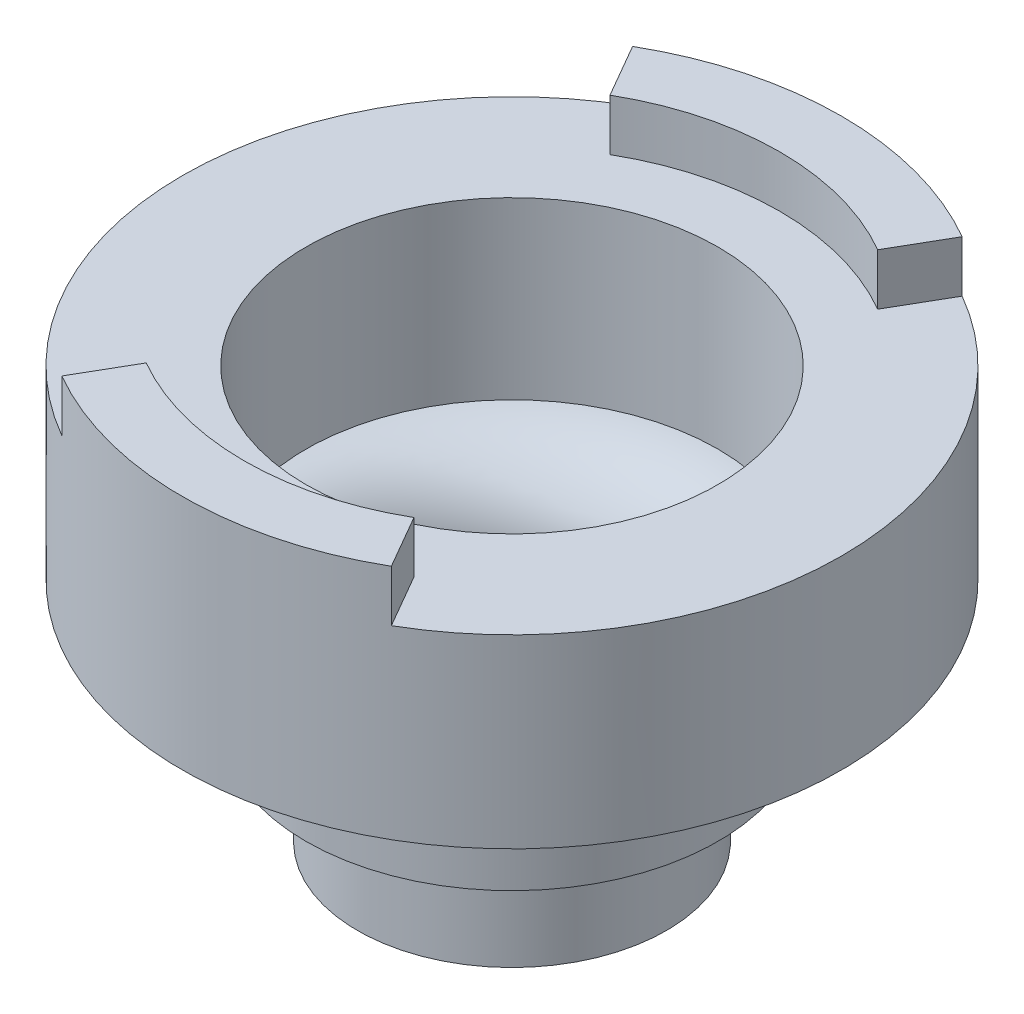
ISO-10303-21;
HEADER;
FILE_DESCRIPTION(('STEP AP214'),'2;1');
FILE_NAME('part.step','',(''),(''),'','','');
FILE_SCHEMA(('AUTOMOTIVE_DESIGN { 1 0 10303 214 1 1 1 1 }'));
ENDSEC;
DATA;
#1=APPLICATION_CONTEXT('core data for automotive mechanical design processes');
#2=APPLICATION_PROTOCOL_DEFINITION('international standard','automotive_design',2000,#1);
#3=PRODUCT_CONTEXT('',#1,'mechanical');
#4=PRODUCT('Part','Part','',(#3));
#5=PRODUCT_RELATED_PRODUCT_CATEGORY('part','',(#4));
#6=PRODUCT_DEFINITION_FORMATION('','',#4);
#7=PRODUCT_DEFINITION_CONTEXT('part definition',#1,'design');
#8=PRODUCT_DEFINITION('design','',#6,#7);
#9=PRODUCT_DEFINITION_SHAPE('','',#8);
#10=(LENGTH_UNIT() NAMED_UNIT(*) SI_UNIT(.MILLI.,.METRE.));
#11=(NAMED_UNIT(*) PLANE_ANGLE_UNIT() SI_UNIT($,.RADIAN.));
#12=(NAMED_UNIT(*) SI_UNIT($,.STERADIAN.) SOLID_ANGLE_UNIT());
#13=UNCERTAINTY_MEASURE_WITH_UNIT(LENGTH_MEASURE(1.E-05),#10,'distance_accuracy_value','');
#14=(GEOMETRIC_REPRESENTATION_CONTEXT(3) GLOBAL_UNCERTAINTY_ASSIGNED_CONTEXT((#13)) GLOBAL_UNIT_ASSIGNED_CONTEXT((#10,
#11,#12)) REPRESENTATION_CONTEXT('',''));
#15=CARTESIAN_POINT('',(0.,0.,0.));
#16=DIRECTION('',(0.,0.,1.));
#17=DIRECTION('',(1.,0.,0.));
#18=AXIS2_PLACEMENT_3D('',#15,#16,#17);
#19=CARTESIAN_POINT('',(0.,0.,0.));
#20=DIRECTION('',(0.,-1.,0.));
#21=DIRECTION('',(0.,0.,-1.));
#22=AXIS2_PLACEMENT_3D('',#19,#20,#21);
#23=PLANE('',#22);
#24=CARTESIAN_POINT('',(0.,0.,0.));
#25=DIRECTION('',(0.,1.,0.));
#26=DIRECTION('',(0.,0.,1.));
#27=AXIS2_PLACEMENT_3D('',#24,#25,#26);
#28=CIRCLE('',#27,20.);
#29=CARTESIAN_POINT('',(0.,0.,20.));
#30=VERTEX_POINT('',#29);
#31=EDGE_CURVE('E207',#30,#30,#28,.T.);
#32=ORIENTED_EDGE('',*,*,#31,.F.);
#33=EDGE_LOOP('',(#32));
#34=FACE_BOUND('',#33,.T.);
#35=DIRECTION('',(-0.500000000000002,0.,-0.866025403784437));
#36=VECTOR('',#35,1.);
#37=CARTESIAN_POINT('',(13.,0.,22.5166604983954));
#38=LINE('',#37,#36);
#39=CARTESIAN_POINT('',(16.,0.,27.712812921102));
#40=VERTEX_POINT('',#39);
#41=CARTESIAN_POINT('',(13.,0.,22.5166604983954));
#42=VERTEX_POINT('',#41);
#43=EDGE_CURVE('E122',#40,#42,#38,.T.);
#44=ORIENTED_EDGE('',*,*,#43,.F.);
#45=CARTESIAN_POINT('',(0.,0.,0.));
#46=DIRECTION('',(0.,-1.,0.));
#47=DIRECTION('',(0.,0.,-1.));
#48=AXIS2_PLACEMENT_3D('',#45,#46,#47);
#49=CIRCLE('',#48,32.);
#50=CARTESIAN_POINT('',(16.0000000000001,0.,-27.712812921102));
#51=VERTEX_POINT('',#50);
#52=EDGE_CURVE('E11',#51,#40,#49,.T.);
#53=ORIENTED_EDGE('',*,*,#52,.F.);
#54=DIRECTION('',(0.500000000000002,0.,-0.866025403784437));
#55=VECTOR('',#54,1.);
#56=CARTESIAN_POINT('',(13.,0.,-22.5166604983954));
#57=LINE('',#56,#55);
#58=CARTESIAN_POINT('',(13.,0.,-22.5166604983954));
#59=VERTEX_POINT('',#58);
#60=EDGE_CURVE('E151',#59,#51,#57,.T.);
#61=ORIENTED_EDGE('',*,*,#60,.F.);
#62=CARTESIAN_POINT('',(0.,0.,0.));
#63=DIRECTION('',(0.,-1.,0.));
#64=DIRECTION('',(0.,0.,1.));
#65=AXIS2_PLACEMENT_3D('',#62,#63,#64);
#66=CIRCLE('',#65,26.);
#67=CARTESIAN_POINT('',(-13.,0.,-22.5166604983954));
#68=VERTEX_POINT('',#67);
#69=EDGE_CURVE('E155',#68,#59,#66,.T.);
#70=ORIENTED_EDGE('',*,*,#69,.F.);
#71=DIRECTION('',(0.500000000000002,0.,0.866025403784438));
#72=VECTOR('',#71,1.);
#73=CARTESIAN_POINT('',(-16.,0.,-27.712812921102));
#74=LINE('',#73,#72);
#75=CARTESIAN_POINT('',(-16.,0.,-27.712812921102));
#76=VERTEX_POINT('',#75);
#77=EDGE_CURVE('E148',#76,#68,#74,.T.);
#78=ORIENTED_EDGE('',*,*,#77,.F.);
#79=CARTESIAN_POINT('',(-16.,0.,27.7128129211021));
#80=VERTEX_POINT('',#79);
#81=EDGE_CURVE('E48',#80,#76,#49,.T.);
#82=ORIENTED_EDGE('',*,*,#81,.F.);
#83=DIRECTION('',(-0.500000000000002,0.,0.866025403784438));
#84=VECTOR('',#83,1.);
#85=CARTESIAN_POINT('',(-16.0000000000001,0.,27.712812921102));
#86=LINE('',#85,#84);
#87=CARTESIAN_POINT('',(-13.,0.,22.5166604983954));
#88=VERTEX_POINT('',#87);
#89=EDGE_CURVE('E60',#88,#80,#86,.T.);
#90=ORIENTED_EDGE('',*,*,#89,.F.);
#91=CARTESIAN_POINT('',(0.,0.,0.));
#92=DIRECTION('',(0.,-1.,0.));
#93=DIRECTION('',(0.,0.,-1.));
#94=AXIS2_PLACEMENT_3D('',#91,#92,#93);
#95=CIRCLE('',#94,26.);
#96=EDGE_CURVE('E55',#42,#88,#95,.T.);
#97=ORIENTED_EDGE('',*,*,#96,.F.);
#98=EDGE_LOOP('',(#44,#53,#61,#70,#78,#82,#90,#97));
#99=FACE_BOUND('',#98,.T.);
#100=ADVANCED_FACE('F39',(#34,#99),#23,.F.);
#101=CARTESIAN_POINT('',(0.,-40.,0.));
#102=DIRECTION('',(0.,1.,0.));
#103=DIRECTION('',(0.,0.,1.));
#104=AXIS2_PLACEMENT_3D('',#101,#102,#103);
#105=PLANE('',#104);
#106=CARTESIAN_POINT('',(0.,-40.,0.));
#107=DIRECTION('',(0.,-1.,0.));
#108=DIRECTION('',(0.,0.,-1.));
#109=AXIS2_PLACEMENT_3D('',#106,#107,#108);
#110=CIRCLE('',#109,8.);
#111=CARTESIAN_POINT('',(0.,-40.,-8.));
#112=VERTEX_POINT('',#111);
#113=EDGE_CURVE('E138',#112,#112,#110,.T.);
#114=ORIENTED_EDGE('',*,*,#113,.F.);
#115=EDGE_LOOP('',(#114));
#116=FACE_BOUND('',#115,.T.);
#117=CARTESIAN_POINT('',(0.,-40.,0.));
#118=DIRECTION('',(0.,-1.,0.));
#119=DIRECTION('',(0.,0.,-1.));
#120=AXIS2_PLACEMENT_3D('',#117,#118,#119);
#121=CIRCLE('',#120,15.);
#122=CARTESIAN_POINT('',(0.,-40.,-15.));
#123=VERTEX_POINT('',#122);
#124=EDGE_CURVE('E125',#123,#123,#121,.T.);
#125=ORIENTED_EDGE('',*,*,#124,.T.);
#126=EDGE_LOOP('',(#125));
#127=FACE_BOUND('',#126,.T.);
#128=ADVANCED_FACE('F41',(#116,#127),#105,.F.);
#129=CARTESIAN_POINT('',(0.,-68.1198392035178,0.));
#130=DIRECTION('',(0.,-1.,0.));
#131=DIRECTION('',(0.,0.,-1.));
#132=AXIS2_PLACEMENT_3D('',#129,#130,#131);
#133=CYLINDRICAL_SURFACE('',#132,32.);
#134=CARTESIAN_POINT('',(0.,-18.,0.));
#135=DIRECTION('',(0.,-1.,0.));
#136=DIRECTION('',(0.,0.,-1.));
#137=AXIS2_PLACEMENT_3D('',#134,#135,#136);
#138=CIRCLE('',#137,32.);
#139=CARTESIAN_POINT('',(0.,-18.,-32.));
#140=VERTEX_POINT('',#139);
#141=EDGE_CURVE('E173',#140,#140,#138,.T.);
#142=ORIENTED_EDGE('',*,*,#141,.F.);
#143=EDGE_LOOP('',(#142));
#144=FACE_BOUND('',#143,.T.);
#145=ORIENTED_EDGE('',*,*,#52,.T.);
#146=DIRECTION('',(0.,-1.,0.));
#147=VECTOR('',#146,1.);
#148=CARTESIAN_POINT('',(16.,5.,27.712812921102));
#149=LINE('',#148,#147);
#150=CARTESIAN_POINT('',(16.,5.,27.712812921102));
#151=VERTEX_POINT('',#150);
#152=EDGE_CURVE('E130',#151,#40,#149,.T.);
#153=ORIENTED_EDGE('',*,*,#152,.F.);
#154=CARTESIAN_POINT('',(0.,5.,0.));
#155=DIRECTION('',(0.,1.,0.));
#156=DIRECTION('',(0.,0.,-1.));
#157=AXIS2_PLACEMENT_3D('',#154,#155,#156);
#158=CIRCLE('',#157,32.0000000000001);
#159=CARTESIAN_POINT('',(-16.,5.,27.7128129211021));
#160=VERTEX_POINT('',#159);
#161=EDGE_CURVE('E112',#160,#151,#158,.T.);
#162=ORIENTED_EDGE('',*,*,#161,.F.);
#163=DIRECTION('',(0.,-1.,0.));
#164=VECTOR('',#163,1.);
#165=CARTESIAN_POINT('',(-16.,5.,27.7128129211021));
#166=LINE('',#165,#164);
#167=EDGE_CURVE('E109',#160,#80,#166,.T.);
#168=ORIENTED_EDGE('',*,*,#167,.T.);
#169=ORIENTED_EDGE('',*,*,#81,.T.);
#170=DIRECTION('',(0.,-1.,0.));
#171=VECTOR('',#170,1.);
#172=CARTESIAN_POINT('',(-16.,5.,-27.712812921102));
#173=LINE('',#172,#171);
#174=CARTESIAN_POINT('',(-16.,5.,-27.712812921102));
#175=VERTEX_POINT('',#174);
#176=EDGE_CURVE('E141',#175,#76,#173,.T.);
#177=ORIENTED_EDGE('',*,*,#176,.F.);
#178=CARTESIAN_POINT('',(0.,5.,0.));
#179=DIRECTION('',(0.,1.,0.));
#180=DIRECTION('',(0.,0.,1.));
#181=AXIS2_PLACEMENT_3D('',#178,#179,#180);
#182=CIRCLE('',#181,32.);
#183=CARTESIAN_POINT('',(16.0000000000001,5.,-27.712812921102));
#184=VERTEX_POINT('',#183);
#185=EDGE_CURVE('E159',#184,#175,#182,.T.);
#186=ORIENTED_EDGE('',*,*,#185,.F.);
#187=DIRECTION('',(0.,-1.,0.));
#188=VECTOR('',#187,1.);
#189=CARTESIAN_POINT('',(16.0000000000001,5.,-27.712812921102));
#190=LINE('',#189,#188);
#191=EDGE_CURVE('E137',#184,#51,#190,.T.);
#192=ORIENTED_EDGE('',*,*,#191,.T.);
#193=EDGE_LOOP('',(#145,#153,#162,#168,#169,#177,#186,#192));
#194=FACE_BOUND('',#193,.T.);
#195=ADVANCED_FACE('F180',(#144,#194),#133,.T.);
#196=CARTESIAN_POINT('',(0.,-18.,0.));
#197=DIRECTION('',(0.,1.,0.));
#198=DIRECTION('',(0.,0.,1.));
#199=AXIS2_PLACEMENT_3D('',#196,#197,#198);
#200=CONICAL_SURFACE('',#199,32.,1.04272187836854);
#201=CARTESIAN_POINT('',(0.,-25.,0.));
#202=DIRECTION('',(0.,-1.,0.));
#203=DIRECTION('',(0.,0.,-1.));
#204=AXIS2_PLACEMENT_3D('',#201,#202,#203);
#205=CIRCLE('',#204,20.);
#206=CARTESIAN_POINT('',(0.,-25.,-20.));
#207=VERTEX_POINT('',#206);
#208=EDGE_CURVE('E170',#207,#207,#205,.T.);
#209=ORIENTED_EDGE('',*,*,#208,.F.);
#210=EDGE_LOOP('',(#209));
#211=FACE_BOUND('',#210,.T.);
#212=ORIENTED_EDGE('',*,*,#141,.T.);
#213=EDGE_LOOP('',(#212));
#214=FACE_BOUND('',#213,.T.);
#215=ADVANCED_FACE('F242',(#211,#214),#200,.T.);
#216=CARTESIAN_POINT('',(0.,-68.1198392035178,0.));
#217=DIRECTION('',(0.,-1.,0.));
#218=DIRECTION('',(0.,0.,-1.));
#219=AXIS2_PLACEMENT_3D('',#216,#217,#218);
#220=CYLINDRICAL_SURFACE('',#219,20.);
#221=CARTESIAN_POINT('',(0.,-30.,0.));
#222=DIRECTION('',(0.,-1.,0.));
#223=DIRECTION('',(0.,0.,-1.));
#224=AXIS2_PLACEMENT_3D('',#221,#222,#223);
#225=CIRCLE('',#224,20.);
#226=CARTESIAN_POINT('',(0.,-30.,-20.));
#227=VERTEX_POINT('',#226);
#228=EDGE_CURVE('E167',#227,#227,#225,.T.);
#229=ORIENTED_EDGE('',*,*,#228,.F.);
#230=EDGE_LOOP('',(#229));
#231=FACE_BOUND('',#230,.T.);
#232=ORIENTED_EDGE('',*,*,#208,.T.);
#233=EDGE_LOOP('',(#232));
#234=FACE_BOUND('',#233,.T.);
#235=ADVANCED_FACE('F246',(#231,#234),#220,.T.);
#236=CARTESIAN_POINT('',(0.,-30.,0.));
#237=DIRECTION('',(0.,1.,0.));
#238=DIRECTION('',(0.,0.,1.));
#239=AXIS2_PLACEMENT_3D('',#236,#237,#238);
#240=PLANE('',#239);
#241=CARTESIAN_POINT('',(0.,-30.,0.));
#242=DIRECTION('',(0.,-1.,0.));
#243=DIRECTION('',(0.,0.,-1.));
#244=AXIS2_PLACEMENT_3D('',#241,#242,#243);
#245=CIRCLE('',#244,15.);
#246=CARTESIAN_POINT('',(0.,-30.,-15.));
#247=VERTEX_POINT('',#246);
#248=EDGE_CURVE('E128',#247,#247,#245,.T.);
#249=ORIENTED_EDGE('',*,*,#248,.F.);
#250=EDGE_LOOP('',(#249));
#251=FACE_BOUND('',#250,.T.);
#252=ORIENTED_EDGE('',*,*,#228,.T.);
#253=EDGE_LOOP('',(#252));
#254=FACE_BOUND('',#253,.T.);
#255=ADVANCED_FACE('F250',(#251,#254),#240,.F.);
#256=CARTESIAN_POINT('',(0.,-68.1198392035178,0.));
#257=DIRECTION('',(0.,-1.,0.));
#258=DIRECTION('',(0.,0.,-1.));
#259=AXIS2_PLACEMENT_3D('',#256,#257,#258);
#260=CYLINDRICAL_SURFACE('',#259,15.);
#261=ORIENTED_EDGE('',*,*,#124,.F.);
#262=EDGE_LOOP('',(#261));
#263=FACE_BOUND('',#262,.T.);
#264=ORIENTED_EDGE('',*,*,#248,.T.);
#265=EDGE_LOOP('',(#264));
#266=FACE_BOUND('',#265,.T.);
#267=ADVANCED_FACE('F254',(#263,#266),#260,.T.);
#268=CARTESIAN_POINT('',(0.,5.,0.));
#269=DIRECTION('',(0.,-1.,0.));
#270=DIRECTION('',(0.,0.,-1.));
#271=AXIS2_PLACEMENT_3D('',#268,#269,#270);
#272=CYLINDRICAL_SURFACE('',#271,26.);
#273=ORIENTED_EDGE('',*,*,#69,.T.);
#274=DIRECTION('',(0.,-1.,0.));
#275=VECTOR('',#274,1.);
#276=CARTESIAN_POINT('',(13.,5.,-22.5166604983954));
#277=LINE('',#276,#275);
#278=CARTESIAN_POINT('',(13.,5.,-22.5166604983954));
#279=VERTEX_POINT('',#278);
#280=EDGE_CURVE('E134',#279,#59,#277,.T.);
#281=ORIENTED_EDGE('',*,*,#280,.F.);
#282=CARTESIAN_POINT('',(0.,5.,0.));
#283=DIRECTION('',(0.,-1.,0.));
#284=DIRECTION('',(0.,0.,1.));
#285=AXIS2_PLACEMENT_3D('',#282,#283,#284);
#286=CIRCLE('',#285,26.);
#287=CARTESIAN_POINT('',(-13.,5.,-22.5166604983954));
#288=VERTEX_POINT('',#287);
#289=EDGE_CURVE('E152',#288,#279,#286,.T.);
#290=ORIENTED_EDGE('',*,*,#289,.F.);
#291=DIRECTION('',(0.,-1.,0.));
#292=VECTOR('',#291,1.);
#293=CARTESIAN_POINT('',(-13.,5.,-22.5166604983954));
#294=LINE('',#293,#292);
#295=EDGE_CURVE('E144',#288,#68,#294,.T.);
#296=ORIENTED_EDGE('',*,*,#295,.T.);
#297=EDGE_LOOP('',(#273,#281,#290,#296));
#298=FACE_BOUND('',#297,.T.);
#299=ADVANCED_FACE('F258',(#298),#272,.F.);
#300=CARTESIAN_POINT('',(13.,5.,-22.5166604983954));
#301=DIRECTION('',(-0.866025403784437,0.,-0.500000000000002));
#302=DIRECTION('',(-0.500000000000002,0.,0.866025403784437));
#303=AXIS2_PLACEMENT_3D('',#300,#301,#302);
#304=PLANE('',#303);
#305=ORIENTED_EDGE('',*,*,#60,.T.);
#306=ORIENTED_EDGE('',*,*,#191,.F.);
#307=DIRECTION('',(0.500000000000002,0.,-0.866025403784437));
#308=VECTOR('',#307,1.);
#309=CARTESIAN_POINT('',(13.,5.,-22.5166604983954));
#310=LINE('',#309,#308);
#311=EDGE_CURVE('E161',#279,#184,#310,.T.);
#312=ORIENTED_EDGE('',*,*,#311,.F.);
#313=ORIENTED_EDGE('',*,*,#280,.T.);
#314=EDGE_LOOP('',(#305,#306,#312,#313));
#315=FACE_BOUND('',#314,.T.);
#316=ADVANCED_FACE('F194',(#315),#304,.F.);
#317=CARTESIAN_POINT('',(-16.,5.,-27.712812921102));
#318=DIRECTION('',(0.866025403784438,0.,-0.500000000000002));
#319=DIRECTION('',(-0.500000000000002,0.,-0.866025403784438));
#320=AXIS2_PLACEMENT_3D('',#317,#318,#319);
#321=PLANE('',#320);
#322=ORIENTED_EDGE('',*,*,#77,.T.);
#323=ORIENTED_EDGE('',*,*,#295,.F.);
#324=DIRECTION('',(0.500000000000002,0.,0.866025403784438));
#325=VECTOR('',#324,1.);
#326=CARTESIAN_POINT('',(-16.,5.,-27.712812921102));
#327=LINE('',#326,#325);
#328=EDGE_CURVE('E147',#175,#288,#327,.T.);
#329=ORIENTED_EDGE('',*,*,#328,.F.);
#330=ORIENTED_EDGE('',*,*,#176,.T.);
#331=EDGE_LOOP('',(#322,#323,#329,#330));
#332=FACE_BOUND('',#331,.T.);
#333=ADVANCED_FACE('F184',(#332),#321,.F.);
#334=CARTESIAN_POINT('',(0.,5.,0.));
#335=DIRECTION('',(0.,1.,0.));
#336=DIRECTION('',(0.,0.,1.));
#337=AXIS2_PLACEMENT_3D('',#334,#335,#336);
#338=PLANE('',#337);
#339=ORIENTED_EDGE('',*,*,#289,.T.);
#340=ORIENTED_EDGE('',*,*,#311,.T.);
#341=ORIENTED_EDGE('',*,*,#185,.T.);
#342=ORIENTED_EDGE('',*,*,#328,.T.);
#343=EDGE_LOOP('',(#339,#340,#341,#342));
#344=FACE_BOUND('',#343,.T.);
#345=ADVANCED_FACE('F188',(#344),#338,.T.);
#346=CARTESIAN_POINT('',(0.,5.,0.));
#347=DIRECTION('',(0.,-1.,0.));
#348=DIRECTION('',(0.,0.,-1.));
#349=AXIS2_PLACEMENT_3D('',#346,#347,#348);
#350=CYLINDRICAL_SURFACE('',#349,26.);
#351=ORIENTED_EDGE('',*,*,#96,.T.);
#352=DIRECTION('',(0.,-1.,0.));
#353=VECTOR('',#352,1.);
#354=CARTESIAN_POINT('',(-13.,5.,22.5166604983954));
#355=LINE('',#354,#353);
#356=CARTESIAN_POINT('',(-13.,5.,22.5166604983954));
#357=VERTEX_POINT('',#356);
#358=EDGE_CURVE('E107',#357,#88,#355,.T.);
#359=ORIENTED_EDGE('',*,*,#358,.F.);
#360=CARTESIAN_POINT('',(0.,5.,0.));
#361=DIRECTION('',(0.,-1.,0.));
#362=DIRECTION('',(0.,0.,-1.));
#363=AXIS2_PLACEMENT_3D('',#360,#361,#362);
#364=CIRCLE('',#363,26.);
#365=CARTESIAN_POINT('',(13.,5.,22.5166604983954));
#366=VERTEX_POINT('',#365);
#367=EDGE_CURVE('E113',#366,#357,#364,.T.);
#368=ORIENTED_EDGE('',*,*,#367,.F.);
#369=DIRECTION('',(0.,-1.,0.));
#370=VECTOR('',#369,1.);
#371=CARTESIAN_POINT('',(13.,5.,22.5166604983954));
#372=LINE('',#371,#370);
#373=EDGE_CURVE('E200',#366,#42,#372,.T.);
#374=ORIENTED_EDGE('',*,*,#373,.T.);
#375=EDGE_LOOP('',(#351,#359,#368,#374));
#376=FACE_BOUND('',#375,.T.);
#377=ADVANCED_FACE('F124',(#376),#350,.F.);
#378=CARTESIAN_POINT('',(-16.0000000000001,5.,27.712812921102));
#379=DIRECTION('',(0.866025403784438,0.,0.500000000000002));
#380=DIRECTION('',(0.500000000000002,0.,-0.866025403784437));
#381=AXIS2_PLACEMENT_3D('',#378,#379,#380);
#382=PLANE('',#381);
#383=ORIENTED_EDGE('',*,*,#89,.T.);
#384=ORIENTED_EDGE('',*,*,#167,.F.);
#385=DIRECTION('',(-0.500000000000002,0.,0.866025403784438));
#386=VECTOR('',#385,1.);
#387=CARTESIAN_POINT('',(-16.0000000000001,5.,27.712812921102));
#388=LINE('',#387,#386);
#389=EDGE_CURVE('E103',#357,#160,#388,.T.);
#390=ORIENTED_EDGE('',*,*,#389,.F.);
#391=ORIENTED_EDGE('',*,*,#358,.T.);
#392=EDGE_LOOP('',(#383,#384,#390,#391));
#393=FACE_BOUND('',#392,.T.);
#394=ADVANCED_FACE('F105',(#393),#382,.F.);
#395=CARTESIAN_POINT('',(13.,5.,22.5166604983954));
#396=DIRECTION('',(-0.866025403784438,0.,0.500000000000002));
#397=DIRECTION('',(0.500000000000002,0.,0.866025403784438));
#398=AXIS2_PLACEMENT_3D('',#395,#396,#397);
#399=PLANE('',#398);
#400=ORIENTED_EDGE('',*,*,#43,.T.);
#401=ORIENTED_EDGE('',*,*,#373,.F.);
#402=DIRECTION('',(-0.500000000000002,0.,-0.866025403784437));
#403=VECTOR('',#402,1.);
#404=CARTESIAN_POINT('',(13.,5.,22.5166604983954));
#405=LINE('',#404,#403);
#406=EDGE_CURVE('E118',#151,#366,#405,.T.);
#407=ORIENTED_EDGE('',*,*,#406,.F.);
#408=ORIENTED_EDGE('',*,*,#152,.T.);
#409=EDGE_LOOP('',(#400,#401,#407,#408));
#410=FACE_BOUND('',#409,.T.);
#411=ADVANCED_FACE('F201',(#410),#399,.F.);
#412=CARTESIAN_POINT('',(0.,5.,0.));
#413=DIRECTION('',(0.,-1.,0.));
#414=DIRECTION('',(0.,0.,-1.));
#415=AXIS2_PLACEMENT_3D('',#412,#413,#414);
#416=PLANE('',#415);
#417=ORIENTED_EDGE('',*,*,#367,.T.);
#418=ORIENTED_EDGE('',*,*,#389,.T.);
#419=ORIENTED_EDGE('',*,*,#161,.T.);
#420=ORIENTED_EDGE('',*,*,#406,.T.);
#421=EDGE_LOOP('',(#417,#418,#419,#420));
#422=FACE_BOUND('',#421,.T.);
#423=ADVANCED_FACE('F116',(#422),#416,.F.);
#424=CARTESIAN_POINT('',(0.,5.,0.));
#425=DIRECTION('',(0.,-1.,0.));
#426=DIRECTION('',(0.,0.,-1.));
#427=AXIS2_PLACEMENT_3D('',#424,#425,#426);
#428=CYLINDRICAL_SURFACE('',#427,8.);
#429=CARTESIAN_POINT('',(0.,-25.,0.));
#430=DIRECTION('',(0.,-1.,0.));
#431=DIRECTION('',(0.,0.,-1.));
#432=AXIS2_PLACEMENT_3D('',#429,#430,#431);
#433=CIRCLE('',#432,8.);
#434=CARTESIAN_POINT('',(0.,-25.,-8.));
#435=VERTEX_POINT('',#434);
#436=EDGE_CURVE('E43',#435,#435,#433,.F.);
#437=CARTESIAN_POINT('',(0.,-25.,-8.));
#438=CARTESIAN_POINT('',(0.,-25.15625,-8.));
#439=CARTESIAN_POINT('',(0.,-25.3125,-8.));
#440=CARTESIAN_POINT('',(0.,-25.625,-8.));
#441=CARTESIAN_POINT('',(0.,-25.78125,-8.));
#442=CARTESIAN_POINT('',(0.,-26.09375,-8.));
#443=CARTESIAN_POINT('',(0.,-26.25,-8.));
#444=CARTESIAN_POINT('',(0.,-26.5625,-8.));
#445=CARTESIAN_POINT('',(0.,-26.71875,-8.));
#446=CARTESIAN_POINT('',(0.,-27.03125,-8.));
#447=CARTESIAN_POINT('',(0.,-27.1875,-8.));
#448=CARTESIAN_POINT('',(0.,-27.5,-8.));
#449=CARTESIAN_POINT('',(0.,-27.65625,-8.));
#450=CARTESIAN_POINT('',(0.,-27.96875,-8.));
#451=CARTESIAN_POINT('',(0.,-28.125,-8.));
#452=CARTESIAN_POINT('',(0.,-28.4375,-8.));
#453=CARTESIAN_POINT('',(0.,-28.59375,-8.));
#454=CARTESIAN_POINT('',(0.,-28.90625,-8.));
#455=CARTESIAN_POINT('',(0.,-29.0625,-8.));
#456=CARTESIAN_POINT('',(0.,-29.375,-8.));
#457=CARTESIAN_POINT('',(0.,-29.53125,-8.));
#458=CARTESIAN_POINT('',(0.,-29.84375,-8.));
#459=CARTESIAN_POINT('',(0.,-30.,-8.));
#460=CARTESIAN_POINT('',(0.,-30.3125,-8.));
#461=CARTESIAN_POINT('',(0.,-30.46875,-8.));
#462=CARTESIAN_POINT('',(0.,-30.78125,-8.));
#463=CARTESIAN_POINT('',(0.,-30.9375,-8.));
#464=CARTESIAN_POINT('',(0.,-31.25,-8.));
#465=CARTESIAN_POINT('',(0.,-31.40625,-8.));
#466=CARTESIAN_POINT('',(0.,-31.71875,-8.));
#467=CARTESIAN_POINT('',(0.,-31.875,-8.));
#468=CARTESIAN_POINT('',(0.,-32.1875,-8.));
#469=CARTESIAN_POINT('',(0.,-32.34375,-8.));
#470=CARTESIAN_POINT('',(0.,-32.65625,-8.));
#471=CARTESIAN_POINT('',(0.,-32.8125,-8.));
#472=CARTESIAN_POINT('',(0.,-33.125,-8.));
#473=CARTESIAN_POINT('',(0.,-33.28125,-8.));
#474=CARTESIAN_POINT('',(0.,-33.59375,-8.));
#475=CARTESIAN_POINT('',(0.,-33.75,-8.));
#476=CARTESIAN_POINT('',(0.,-34.0625,-8.));
#477=CARTESIAN_POINT('',(0.,-34.21875,-8.));
#478=CARTESIAN_POINT('',(0.,-34.53125,-8.));
#479=CARTESIAN_POINT('',(0.,-34.6875,-8.));
#480=CARTESIAN_POINT('',(0.,-35.,-8.));
#481=CARTESIAN_POINT('',(0.,-35.15625,-8.));
#482=CARTESIAN_POINT('',(0.,-35.46875,-8.));
#483=CARTESIAN_POINT('',(0.,-35.625,-8.));
#484=CARTESIAN_POINT('',(0.,-35.9375,-8.));
#485=CARTESIAN_POINT('',(0.,-36.09375,-8.));
#486=CARTESIAN_POINT('',(0.,-36.40625,-8.));
#487=CARTESIAN_POINT('',(0.,-36.5625,-8.));
#488=CARTESIAN_POINT('',(0.,-36.875,-8.));
#489=CARTESIAN_POINT('',(0.,-37.03125,-8.));
#490=CARTESIAN_POINT('',(0.,-37.34375,-8.));
#491=CARTESIAN_POINT('',(0.,-37.5,-8.));
#492=CARTESIAN_POINT('',(0.,-37.8125,-8.));
#493=CARTESIAN_POINT('',(0.,-37.96875,-8.));
#494=CARTESIAN_POINT('',(0.,-38.28125,-8.));
#495=CARTESIAN_POINT('',(0.,-38.4375,-8.));
#496=CARTESIAN_POINT('',(0.,-38.75,-8.));
#497=CARTESIAN_POINT('',(0.,-38.90625,-8.));
#498=CARTESIAN_POINT('',(0.,-39.21875,-8.));
#499=CARTESIAN_POINT('',(0.,-39.375,-8.));
#500=CARTESIAN_POINT('',(0.,-39.6875,-8.));
#501=CARTESIAN_POINT('',(0.,-39.84375,-8.));
#502=CARTESIAN_POINT('',(0.,-40.,-8.));
#503=B_SPLINE_CURVE_WITH_KNOTS('',3,(#437,#438,#439,#440,#441,#442,#443,#444,#445,#446,#447,
#448,#449,#450,#451,#452,#453,#454,#455,#456,#457,#458,#459,#460,#461,#462,#463,#464,#465,#466,
#467,#468,#469,#470,#471,#472,#473,#474,#475,#476,#477,#478,#479,#480,#481,#482,#483,#484,#485,
#486,#487,#488,#489,#490,#491,#492,#493,#494,#495,#496,#497,#498,#499,#500,#501,#502),
.UNSPECIFIED.,.F.,.F.,(4,2,2,2,2,2,2,2,2,2,2,2,2,2,2,2,2,2,2,2,2,2,2,2,2,2,2,2,2,2,2,2,4),(0.,
0.46875,0.937500000000001,1.40624999999999,1.875,2.34375,2.8125,3.28125,3.75,4.21875,4.6875,
5.15625,5.625,6.09375,6.5625,7.03125,7.5,7.96875,8.4375,8.90625,9.375,9.84375,10.3125,10.78125,
11.25,11.71875,12.1875,12.65625,13.125,13.59375,14.0625,14.53125,15.),.UNSPECIFIED.);
#504=EDGE_CURVE('BSEAM277',#435,#112,#503,.T.);
#505=ORIENTED_EDGE('',*,*,#436,.T.);
#506=ORIENTED_EDGE('',*,*,#113,.T.);
#507=ORIENTED_EDGE('',*,*,#504,.T.);
#508=ORIENTED_EDGE('',*,*,#504,.F.);
#509=EDGE_LOOP('',(#505,#507,#506,#508));
#510=FACE_BOUND('',#509,.T.);
#511=ADVANCED_FACE('F277',(#510),#428,.F.);
#512=CARTESIAN_POINT('',(0.,-25.,0.));
#513=DIRECTION('',(0.,-1.,0.));
#514=DIRECTION('',(0.,0.,-1.));
#515=AXIS2_PLACEMENT_3D('',#512,#513,#514);
#516=PLANE('',#515);
#517=CARTESIAN_POINT('',(0.,-25.,0.));
#518=DIRECTION('',(0.,1.,0.));
#519=DIRECTION('',(0.,0.,1.));
#520=AXIS2_PLACEMENT_3D('',#517,#518,#519);
#521=CIRCLE('',#520,12.);
#522=CARTESIAN_POINT('',(0.,-25.,12.));
#523=VERTEX_POINT('',#522);
#524=EDGE_CURVE('E213',#523,#523,#521,.T.);
#525=ORIENTED_EDGE('',*,*,#524,.T.);
#526=EDGE_LOOP('',(#525));
#527=FACE_BOUND('',#526,.T.);
#528=ORIENTED_EDGE('',*,*,#436,.F.);
#529=EDGE_LOOP('',(#528));
#530=FACE_BOUND('',#529,.T.);
#531=ADVANCED_FACE('F217',(#527,#530),#516,.F.);
#532=CARTESIAN_POINT('',(0.,48.1927519335111,0.));
#533=DIRECTION('',(0.,1.,0.));
#534=DIRECTION('',(0.,0.,1.));
#535=AXIS2_PLACEMENT_3D('',#532,#533,#534);
#536=CYLINDRICAL_SURFACE('',#535,20.);
#537=CARTESIAN_POINT('',(0.,-17.,0.));
#538=DIRECTION('',(0.,1.,0.));
#539=DIRECTION('',(0.,0.,1.));
#540=AXIS2_PLACEMENT_3D('',#537,#538,#539);
#541=CIRCLE('',#540,20.);
#542=CARTESIAN_POINT('',(0.,-17.,20.));
#543=VERTEX_POINT('',#542);
#544=EDGE_CURVE('E210',#543,#543,#541,.T.);
#545=ORIENTED_EDGE('',*,*,#544,.F.);
#546=EDGE_LOOP('',(#545));
#547=FACE_BOUND('',#546,.T.);
#548=ORIENTED_EDGE('',*,*,#31,.T.);
#549=EDGE_LOOP('',(#548));
#550=FACE_BOUND('',#549,.T.);
#551=ADVANCED_FACE('F222',(#547,#550),#536,.F.);
#552=CARTESIAN_POINT('',(0.,-25.,0.));
#553=DIRECTION('',(0.,1.,0.));
#554=DIRECTION('',(0.,0.,1.));
#555=AXIS2_PLACEMENT_3D('',#552,#553,#554);
#556=TOROIDAL_SURFACE('',#555,20.,8.);
#557=ORIENTED_EDGE('',*,*,#544,.T.);
#558=EDGE_LOOP('',(#557));
#559=FACE_BOUND('',#558,.T.);
#560=ORIENTED_EDGE('',*,*,#524,.F.);
#561=EDGE_LOOP('',(#560));
#562=FACE_BOUND('',#561,.T.);
#563=ADVANCED_FACE('F220',(#559,#562),#556,.T.);
#564=CLOSED_SHELL('',(#100,#128,#195,#215,#235,#255,#267,#299,#316,#333,#345,#377,#394,#411,
#423,#511,#531,#551,#563));
#565=MANIFOLD_SOLID_BREP('B2',#564);
#566=ADVANCED_BREP_SHAPE_REPRESENTATION('',(#18,#565),#14);
#567=SHAPE_DEFINITION_REPRESENTATION(#9,#566);
ENDSEC;
END-ISO-10303-21;
